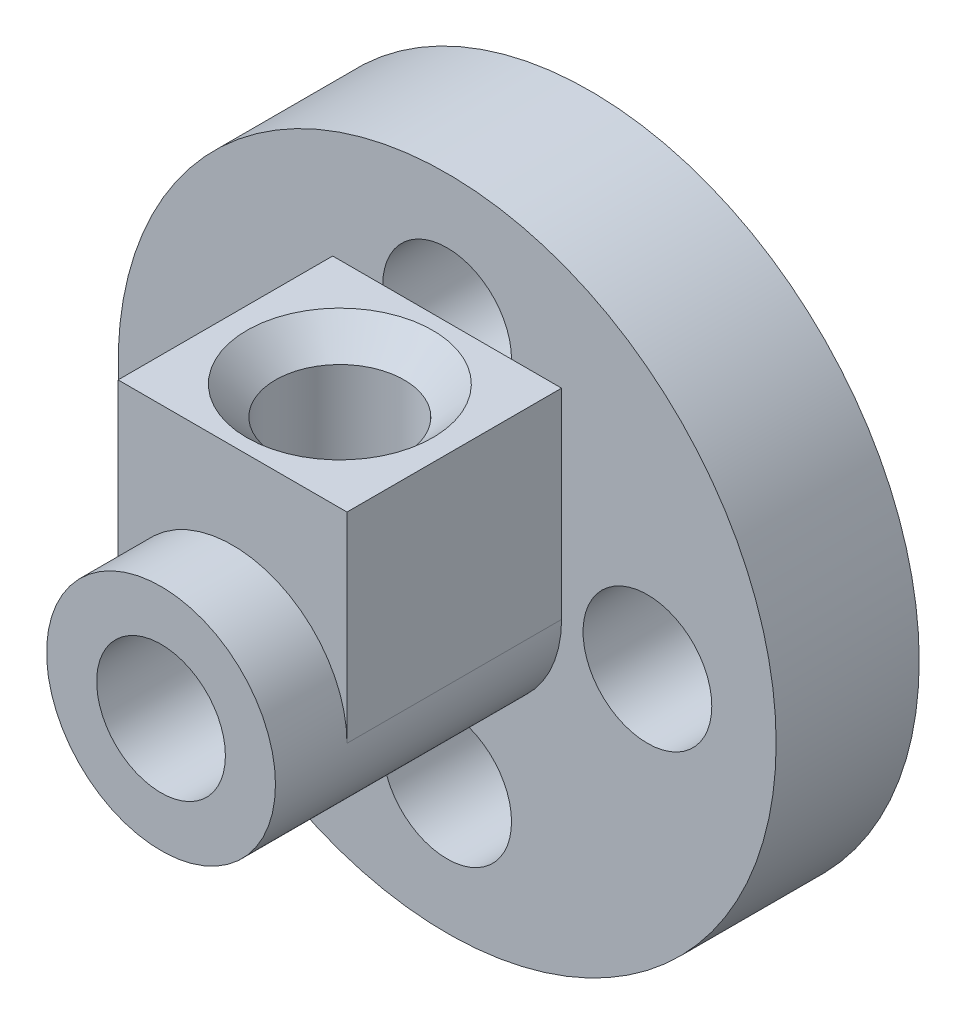
ISO-10303-21;
HEADER;
FILE_DESCRIPTION(('STEP AP214'),'2;1');
FILE_NAME('part.step','',(''),(''),'','','');
FILE_SCHEMA(('AUTOMOTIVE_DESIGN { 1 0 10303 214 1 1 1 1 }'));
ENDSEC;
DATA;
#1=APPLICATION_CONTEXT('core data for automotive mechanical design processes');
#2=APPLICATION_PROTOCOL_DEFINITION('international standard','automotive_design',2000,#1);
#3=PRODUCT_CONTEXT('',#1,'mechanical');
#4=PRODUCT('Part','Part','',(#3));
#5=PRODUCT_RELATED_PRODUCT_CATEGORY('part','',(#4));
#6=PRODUCT_DEFINITION_FORMATION('','',#4);
#7=PRODUCT_DEFINITION_CONTEXT('part definition',#1,'design');
#8=PRODUCT_DEFINITION('design','',#6,#7);
#9=PRODUCT_DEFINITION_SHAPE('','',#8);
#10=(LENGTH_UNIT() NAMED_UNIT(*) SI_UNIT(.MILLI.,.METRE.));
#11=(NAMED_UNIT(*) PLANE_ANGLE_UNIT() SI_UNIT($,.RADIAN.));
#12=(NAMED_UNIT(*) SI_UNIT($,.STERADIAN.) SOLID_ANGLE_UNIT());
#13=UNCERTAINTY_MEASURE_WITH_UNIT(LENGTH_MEASURE(1.E-05),#10,'distance_accuracy_value','');
#14=(GEOMETRIC_REPRESENTATION_CONTEXT(3) GLOBAL_UNCERTAINTY_ASSIGNED_CONTEXT((#13)) GLOBAL_UNIT_ASSIGNED_CONTEXT((#10,
#11,#12)) REPRESENTATION_CONTEXT('',''));
#15=CARTESIAN_POINT('',(0.,0.,0.));
#16=DIRECTION('',(0.,0.,1.));
#17=DIRECTION('',(1.,0.,0.));
#18=AXIS2_PLACEMENT_3D('',#15,#16,#17);
#19=CARTESIAN_POINT('',(0.,0.,15.));
#20=DIRECTION('',(0.,0.,-1.));
#21=DIRECTION('',(-1.,0.,0.));
#22=AXIS2_PLACEMENT_3D('',#19,#20,#21);
#23=CYLINDRICAL_SURFACE('',#22,4.);
#24=CARTESIAN_POINT('',(0.,0.,15.));
#25=DIRECTION('',(0.,0.,1.));
#26=DIRECTION('',(1.,0.,0.));
#27=AXIS2_PLACEMENT_3D('',#24,#25,#26);
#28=CIRCLE('',#27,4.);
#29=CARTESIAN_POINT('',(4.,0.,15.));
#30=VERTEX_POINT('',#29);
#31=EDGE_CURVE('E137',#30,#30,#28,.T.);
#32=ORIENTED_EDGE('',*,*,#31,.F.);
#33=EDGE_LOOP('',(#32));
#34=FACE_BOUND('',#33,.T.);
#35=DIRECTION('',(0.,0.,-1.));
#36=VECTOR('',#35,1.);
#37=CARTESIAN_POINT('',(4.,0.,15.));
#38=LINE('',#37,#36);
#39=CARTESIAN_POINT('',(4.,0.,5.));
#40=VERTEX_POINT('',#39);
#41=CARTESIAN_POINT('',(4.,0.,12.5));
#42=VERTEX_POINT('',#41);
#43=EDGE_CURVE('E97',#40,#42,#38,.F.);
#44=ORIENTED_EDGE('',*,*,#43,.T.);
#45=CARTESIAN_POINT('',(0.,0.,12.5));
#46=DIRECTION('',(0.,0.,1.));
#47=DIRECTION('',(1.,0.,0.));
#48=AXIS2_PLACEMENT_3D('',#45,#46,#47);
#49=CIRCLE('',#48,4.);
#50=CARTESIAN_POINT('',(-4.,0.,12.5));
#51=VERTEX_POINT('',#50);
#52=EDGE_CURVE('E119',#51,#42,#49,.F.);
#53=ORIENTED_EDGE('',*,*,#52,.F.);
#54=DIRECTION('',(0.,0.,-1.));
#55=VECTOR('',#54,1.);
#56=CARTESIAN_POINT('',(-4.,0.,15.));
#57=LINE('',#56,#55);
#58=CARTESIAN_POINT('',(-4.,0.,5.));
#59=VERTEX_POINT('',#58);
#60=EDGE_CURVE('E100',#59,#51,#57,.F.);
#61=ORIENTED_EDGE('',*,*,#60,.F.);
#62=CARTESIAN_POINT('',(0.,0.,5.));
#63=DIRECTION('',(0.,0.,1.));
#64=DIRECTION('',(1.,0.,0.));
#65=AXIS2_PLACEMENT_3D('',#62,#63,#64);
#66=CIRCLE('',#65,4.);
#67=EDGE_CURVE('E134',#59,#40,#66,.T.);
#68=ORIENTED_EDGE('',*,*,#67,.T.);
#69=EDGE_LOOP('',(#44,#53,#61,#68));
#70=FACE_BOUND('',#69,.T.);
#71=ADVANCED_FACE('F39',(#34,#70),#23,.T.);
#72=CARTESIAN_POINT('',(0.,0.,5.));
#73=DIRECTION('',(0.,0.,-1.));
#74=DIRECTION('',(-1.,0.,0.));
#75=AXIS2_PLACEMENT_3D('',#72,#73,#74);
#76=CYLINDRICAL_SURFACE('',#75,11.5);
#77=CARTESIAN_POINT('',(0.,0.,5.));
#78=DIRECTION('',(0.,0.,1.));
#79=DIRECTION('',(1.,0.,0.));
#80=AXIS2_PLACEMENT_3D('',#77,#78,#79);
#81=CIRCLE('',#80,11.5);
#82=CARTESIAN_POINT('',(11.5,0.,5.));
#83=VERTEX_POINT('',#82);
#84=EDGE_CURVE('E155',#83,#83,#81,.T.);
#85=ORIENTED_EDGE('',*,*,#84,.F.);
#86=EDGE_LOOP('',(#85));
#87=FACE_BOUND('',#86,.T.);
#88=CARTESIAN_POINT('',(0.,0.,0.));
#89=DIRECTION('',(0.,0.,1.));
#90=DIRECTION('',(1.,0.,0.));
#91=AXIS2_PLACEMENT_3D('',#88,#89,#90);
#92=CIRCLE('',#91,11.5);
#93=CARTESIAN_POINT('',(11.5,0.,0.));
#94=VERTEX_POINT('',#93);
#95=EDGE_CURVE('E154',#94,#94,#92,.T.);
#96=ORIENTED_EDGE('',*,*,#95,.T.);
#97=EDGE_LOOP('',(#96));
#98=FACE_BOUND('',#97,.T.);
#99=ADVANCED_FACE('F208',(#87,#98),#76,.T.);
#100=CARTESIAN_POINT('',(0.,0.,5.));
#101=DIRECTION('',(0.,0.,1.));
#102=DIRECTION('',(1.,0.,0.));
#103=AXIS2_PLACEMENT_3D('',#100,#101,#102);
#104=PLANE('',#103);
#105=DIRECTION('',(0.,1.,0.));
#106=VECTOR('',#105,1.);
#107=CARTESIAN_POINT('',(4.,-11.502,5.));
#108=LINE('',#107,#106);
#109=CARTESIAN_POINT('',(4.,7.,5.));
#110=VERTEX_POINT('',#109);
#111=EDGE_CURVE('E124',#40,#110,#108,.T.);
#112=ORIENTED_EDGE('',*,*,#111,.F.);
#113=ORIENTED_EDGE('',*,*,#67,.F.);
#114=DIRECTION('',(0.,1.,0.));
#115=VECTOR('',#114,1.);
#116=CARTESIAN_POINT('',(-4.,-11.502,5.));
#117=LINE('',#116,#115);
#118=CARTESIAN_POINT('',(-4.,7.,5.));
#119=VERTEX_POINT('',#118);
#120=EDGE_CURVE('E62',#59,#119,#117,.T.);
#121=ORIENTED_EDGE('',*,*,#120,.T.);
#122=DIRECTION('',(-1.,0.,0.));
#123=VECTOR('',#122,1.);
#124=CARTESIAN_POINT('',(-4.,7.,5.));
#125=LINE('',#124,#123);
#126=CARTESIAN_POINT('',(-2.25,7.,5.));
#127=VERTEX_POINT('',#126);
#128=EDGE_CURVE('E111',#127,#119,#125,.T.);
#129=ORIENTED_EDGE('',*,*,#128,.F.);
#130=CARTESIAN_POINT('',(0.,7.,5.));
#131=DIRECTION('',(0.,0.,1.));
#132=DIRECTION('',(1.,0.,0.));
#133=AXIS2_PLACEMENT_3D('',#130,#131,#132);
#134=CIRCLE('',#133,2.25);
#135=CARTESIAN_POINT('',(2.25,7.,5.));
#136=VERTEX_POINT('',#135);
#137=EDGE_CURVE('E146',#136,#127,#134,.T.);
#138=ORIENTED_EDGE('',*,*,#137,.F.);
#139=EDGE_CURVE('E107',#110,#136,#125,.T.);
#140=ORIENTED_EDGE('',*,*,#139,.F.);
#141=EDGE_LOOP('',(#112,#113,#121,#129,#138,#140));
#142=FACE_BOUND('',#141,.T.);
#143=CARTESIAN_POINT('',(-7.,0.,5.));
#144=DIRECTION('',(0.,0.,1.));
#145=DIRECTION('',(0.,1.,0.));
#146=AXIS2_PLACEMENT_3D('',#143,#144,#145);
#147=CIRCLE('',#146,2.25);
#148=CARTESIAN_POINT('',(-7.00000000000001,2.24999999999998,5.));
#149=VERTEX_POINT('',#148);
#150=EDGE_CURVE('E143',#149,#149,#147,.T.);
#151=ORIENTED_EDGE('',*,*,#150,.F.);
#152=EDGE_LOOP('',(#151));
#153=FACE_BOUND('',#152,.T.);
#154=CARTESIAN_POINT('',(0.,-7.,5.));
#155=DIRECTION('',(0.,0.,1.));
#156=DIRECTION('',(-1.,0.,0.));
#157=AXIS2_PLACEMENT_3D('',#154,#155,#156);
#158=CIRCLE('',#157,2.25);
#159=CARTESIAN_POINT('',(-2.25,-7.,5.));
#160=VERTEX_POINT('',#159);
#161=EDGE_CURVE('E147',#160,#160,#158,.T.);
#162=ORIENTED_EDGE('',*,*,#161,.F.);
#163=EDGE_LOOP('',(#162));
#164=FACE_BOUND('',#163,.T.);
#165=CARTESIAN_POINT('',(7.,0.,5.));
#166=DIRECTION('',(0.,0.,1.));
#167=DIRECTION('',(0.,-1.,0.));
#168=AXIS2_PLACEMENT_3D('',#165,#166,#167);
#169=CIRCLE('',#168,2.25);
#170=CARTESIAN_POINT('',(7.00000000000002,-2.24999999999993,5.));
#171=VERTEX_POINT('',#170);
#172=EDGE_CURVE('E140',#171,#171,#169,.T.);
#173=ORIENTED_EDGE('',*,*,#172,.F.);
#174=EDGE_LOOP('',(#173));
#175=FACE_BOUND('',#174,.T.);
#176=ORIENTED_EDGE('',*,*,#84,.T.);
#177=EDGE_LOOP('',(#176));
#178=FACE_BOUND('',#177,.T.);
#179=ADVANCED_FACE('F199',(#142,#153,#164,#175,#178),#104,.T.);
#180=CARTESIAN_POINT('',(0.,0.,0.));
#181=DIRECTION('',(0.,0.,1.));
#182=DIRECTION('',(1.,0.,0.));
#183=AXIS2_PLACEMENT_3D('',#180,#181,#182);
#184=PLANE('',#183);
#185=CARTESIAN_POINT('',(0.,-7.,0.));
#186=DIRECTION('',(0.,0.,1.));
#187=DIRECTION('',(1.,0.,0.));
#188=AXIS2_PLACEMENT_3D('',#185,#186,#187);
#189=CIRCLE('',#188,3.25);
#190=CARTESIAN_POINT('',(3.25,-7.,0.));
#191=VERTEX_POINT('',#190);
#192=EDGE_CURVE('E175',#191,#191,#189,.T.);
#193=ORIENTED_EDGE('',*,*,#192,.T.);
#194=EDGE_LOOP('',(#193));
#195=FACE_BOUND('',#194,.T.);
#196=CARTESIAN_POINT('',(-7.,0.,0.));
#197=DIRECTION('',(0.,0.,1.));
#198=DIRECTION('',(1.,0.,0.));
#199=AXIS2_PLACEMENT_3D('',#196,#197,#198);
#200=CIRCLE('',#199,3.25);
#201=CARTESIAN_POINT('',(-3.75,0.,0.));
#202=VERTEX_POINT('',#201);
#203=EDGE_CURVE('E172',#202,#202,#200,.T.);
#204=ORIENTED_EDGE('',*,*,#203,.T.);
#205=EDGE_LOOP('',(#204));
#206=FACE_BOUND('',#205,.T.);
#207=CARTESIAN_POINT('',(7.,0.,0.));
#208=DIRECTION('',(0.,0.,1.));
#209=DIRECTION('',(1.,0.,0.));
#210=AXIS2_PLACEMENT_3D('',#207,#208,#209);
#211=CIRCLE('',#210,3.25);
#212=CARTESIAN_POINT('',(10.25,0.,0.));
#213=VERTEX_POINT('',#212);
#214=EDGE_CURVE('E169',#213,#213,#211,.T.);
#215=ORIENTED_EDGE('',*,*,#214,.T.);
#216=EDGE_LOOP('',(#215));
#217=FACE_BOUND('',#216,.T.);
#218=CARTESIAN_POINT('',(0.,7.,0.));
#219=DIRECTION('',(0.,0.,1.));
#220=DIRECTION('',(1.,0.,0.));
#221=AXIS2_PLACEMENT_3D('',#218,#219,#220);
#222=CIRCLE('',#221,3.25);
#223=CARTESIAN_POINT('',(3.25,7.,0.));
#224=VERTEX_POINT('',#223);
#225=EDGE_CURVE('E166',#224,#224,#222,.T.);
#226=ORIENTED_EDGE('',*,*,#225,.T.);
#227=EDGE_LOOP('',(#226));
#228=FACE_BOUND('',#227,.T.);
#229=CARTESIAN_POINT('',(0.,0.,0.));
#230=DIRECTION('',(0.,0.,1.));
#231=DIRECTION('',(1.,0.,0.));
#232=AXIS2_PLACEMENT_3D('',#229,#230,#231);
#233=CIRCLE('',#232,2.25);
#234=CARTESIAN_POINT('',(2.25,0.,0.));
#235=VERTEX_POINT('',#234);
#236=EDGE_CURVE('E131',#235,#235,#233,.T.);
#237=ORIENTED_EDGE('',*,*,#236,.T.);
#238=EDGE_LOOP('',(#237));
#239=FACE_BOUND('',#238,.T.);
#240=ORIENTED_EDGE('',*,*,#95,.F.);
#241=EDGE_LOOP('',(#240));
#242=FACE_BOUND('',#241,.T.);
#243=ADVANCED_FACE('F195',(#195,#206,#217,#228,#239,#242),#184,.F.);
#244=CARTESIAN_POINT('',(0.,7.,0.));
#245=DIRECTION('',(0.,0.,1.));
#246=DIRECTION('',(1.,0.,0.));
#247=AXIS2_PLACEMENT_3D('',#244,#245,#246);
#248=CYLINDRICAL_SURFACE('',#247,2.25);
#249=CARTESIAN_POINT('',(0.,7.,1.));
#250=DIRECTION('',(0.,0.,1.));
#251=DIRECTION('',(1.,0.,0.));
#252=AXIS2_PLACEMENT_3D('',#249,#250,#251);
#253=CIRCLE('',#252,2.25);
#254=CARTESIAN_POINT('',(2.25,7.,1.));
#255=VERTEX_POINT('',#254);
#256=EDGE_CURVE('E11',#255,#255,#253,.F.);
#257=ORIENTED_EDGE('',*,*,#256,.T.);
#258=EDGE_LOOP('',(#257));
#259=FACE_BOUND('',#258,.T.);
#260=ORIENTED_EDGE('',*,*,#137,.T.);
#261=CARTESIAN_POINT('',(0.,7.,5.));
#262=DIRECTION('',(0.,0.,-1.));
#263=DIRECTION('',(-1.,0.,0.));
#264=AXIS2_PLACEMENT_3D('',#261,#262,#263);
#265=CIRCLE('',#264,2.25);
#266=EDGE_CURVE('E115',#127,#136,#265,.F.);
#267=ORIENTED_EDGE('',*,*,#266,.T.);
#268=EDGE_LOOP('',(#260,#267));
#269=FACE_BOUND('',#268,.T.);
#270=ADVANCED_FACE('F198',(#259,#269),#248,.F.);
#271=CARTESIAN_POINT('',(7.,0.,0.));
#272=DIRECTION('',(0.,0.,1.));
#273=DIRECTION('',(1.,0.,0.));
#274=AXIS2_PLACEMENT_3D('',#271,#272,#273);
#275=CYLINDRICAL_SURFACE('',#274,2.25);
#276=CARTESIAN_POINT('',(7.,0.,1.));
#277=DIRECTION('',(0.,0.,1.));
#278=DIRECTION('',(1.,0.,0.));
#279=AXIS2_PLACEMENT_3D('',#276,#277,#278);
#280=CIRCLE('',#279,2.25);
#281=CARTESIAN_POINT('',(9.25,0.,1.));
#282=VERTEX_POINT('',#281);
#283=EDGE_CURVE('E48',#282,#282,#280,.F.);
#284=ORIENTED_EDGE('',*,*,#283,.T.);
#285=EDGE_LOOP('',(#284));
#286=FACE_BOUND('',#285,.T.);
#287=ORIENTED_EDGE('',*,*,#172,.T.);
#288=EDGE_LOOP('',(#287));
#289=FACE_BOUND('',#288,.T.);
#290=ADVANCED_FACE('F186',(#286,#289),#275,.F.);
#291=CARTESIAN_POINT('',(0.,-7.,0.));
#292=DIRECTION('',(0.,0.,1.));
#293=DIRECTION('',(1.,0.,0.));
#294=AXIS2_PLACEMENT_3D('',#291,#292,#293);
#295=CYLINDRICAL_SURFACE('',#294,2.25);
#296=CARTESIAN_POINT('',(0.,-7.,1.));
#297=DIRECTION('',(0.,0.,1.));
#298=DIRECTION('',(1.,0.,0.));
#299=AXIS2_PLACEMENT_3D('',#296,#297,#298);
#300=CIRCLE('',#299,2.25);
#301=CARTESIAN_POINT('',(2.25,-7.,1.));
#302=VERTEX_POINT('',#301);
#303=EDGE_CURVE('E178',#302,#302,#300,.F.);
#304=ORIENTED_EDGE('',*,*,#303,.T.);
#305=EDGE_LOOP('',(#304));
#306=FACE_BOUND('',#305,.T.);
#307=ORIENTED_EDGE('',*,*,#161,.T.);
#308=EDGE_LOOP('',(#307));
#309=FACE_BOUND('',#308,.T.);
#310=ADVANCED_FACE('F257',(#306,#309),#295,.F.);
#311=CARTESIAN_POINT('',(-7.,0.,0.));
#312=DIRECTION('',(0.,0.,1.));
#313=DIRECTION('',(1.,0.,0.));
#314=AXIS2_PLACEMENT_3D('',#311,#312,#313);
#315=CYLINDRICAL_SURFACE('',#314,2.25);
#316=CARTESIAN_POINT('',(-7.,0.,1.));
#317=DIRECTION('',(0.,0.,1.));
#318=DIRECTION('',(1.,0.,0.));
#319=AXIS2_PLACEMENT_3D('',#316,#317,#318);
#320=CIRCLE('',#319,2.25);
#321=CARTESIAN_POINT('',(-4.75,0.,1.));
#322=VERTEX_POINT('',#321);
#323=EDGE_CURVE('E181',#322,#322,#320,.F.);
#324=ORIENTED_EDGE('',*,*,#323,.T.);
#325=EDGE_LOOP('',(#324));
#326=FACE_BOUND('',#325,.T.);
#327=ORIENTED_EDGE('',*,*,#150,.T.);
#328=EDGE_LOOP('',(#327));
#329=FACE_BOUND('',#328,.T.);
#330=ADVANCED_FACE('F253',(#326,#329),#315,.F.);
#331=CARTESIAN_POINT('',(0.,0.,15.));
#332=DIRECTION('',(0.,0.,1.));
#333=DIRECTION('',(1.,0.,0.));
#334=AXIS2_PLACEMENT_3D('',#331,#332,#333);
#335=PLANE('',#334);
#336=CARTESIAN_POINT('',(0.,0.,15.));
#337=DIRECTION('',(0.,0.,1.));
#338=DIRECTION('',(1.,0.,0.));
#339=AXIS2_PLACEMENT_3D('',#336,#337,#338);
#340=CIRCLE('',#339,2.25);
#341=CARTESIAN_POINT('',(2.25,0.,15.));
#342=VERTEX_POINT('',#341);
#343=EDGE_CURVE('E130',#342,#342,#340,.T.);
#344=ORIENTED_EDGE('',*,*,#343,.F.);
#345=EDGE_LOOP('',(#344));
#346=FACE_BOUND('',#345,.T.);
#347=ORIENTED_EDGE('',*,*,#31,.T.);
#348=EDGE_LOOP('',(#347));
#349=FACE_BOUND('',#348,.T.);
#350=ADVANCED_FACE('F256',(#346,#349),#335,.T.);
#351=CARTESIAN_POINT('',(0.,0.,0.));
#352=DIRECTION('',(0.,0.,1.));
#353=DIRECTION('',(1.,0.,0.));
#354=AXIS2_PLACEMENT_3D('',#351,#352,#353);
#355=CYLINDRICAL_SURFACE('',#354,2.25);
#356=CARTESIAN_POINT('',(0.,0.,8.75));
#357=DIRECTION('',(0.,-0.707106781186547,0.707106781186547));
#358=DIRECTION('',(0.,0.707106781186547,0.707106781186547));
#359=AXIS2_PLACEMENT_3D('',#356,#357,#358);
#360=ELLIPSE('',#359,3.18198051533946,2.25);
#361=CARTESIAN_POINT('',(-2.25,0.,8.75));
#362=VERTEX_POINT('',#361);
#363=CARTESIAN_POINT('',(2.25,0.,8.75));
#364=VERTEX_POINT('',#363);
#365=EDGE_CURVE('E91',#362,#364,#360,.F.);
#366=ORIENTED_EDGE('',*,*,#365,.T.);
#367=CARTESIAN_POINT('',(0.,0.,8.75));
#368=DIRECTION('',(0.,0.707106781186547,0.707106781186547));
#369=DIRECTION('',(0.,-0.707106781186547,0.707106781186547));
#370=AXIS2_PLACEMENT_3D('',#367,#368,#369);
#371=ELLIPSE('',#370,3.18198051533946,2.25);
#372=EDGE_CURVE('E54',#364,#362,#371,.T.);
#373=ORIENTED_EDGE('',*,*,#372,.T.);
#374=EDGE_LOOP('',(#366,#373));
#375=FACE_BOUND('',#374,.T.);
#376=ORIENTED_EDGE('',*,*,#236,.F.);
#377=EDGE_LOOP('',(#376));
#378=FACE_BOUND('',#377,.T.);
#379=ORIENTED_EDGE('',*,*,#343,.T.);
#380=EDGE_LOOP('',(#379));
#381=FACE_BOUND('',#380,.T.);
#382=ADVANCED_FACE('F95',(#375,#378,#381),#355,.F.);
#383=CARTESIAN_POINT('',(-4.,-11.502,5.));
#384=DIRECTION('',(0.,0.,-1.));
#385=DIRECTION('',(-1.,0.,0.));
#386=AXIS2_PLACEMENT_3D('',#383,#384,#385);
#387=PLANE('',#386);
#388=ORIENTED_EDGE('',*,*,#266,.F.);
#389=EDGE_CURVE('E110',#136,#127,#125,.T.);
#390=ORIENTED_EDGE('',*,*,#389,.F.);
#391=EDGE_LOOP('',(#388,#390));
#392=FACE_BOUND('',#391,.T.);
#393=ADVANCED_FACE('F282',(#392),#387,.T.);
#394=CARTESIAN_POINT('',(4.,-11.502,5.));
#395=DIRECTION('',(1.,0.,0.));
#396=DIRECTION('',(0.,0.,-1.));
#397=AXIS2_PLACEMENT_3D('',#394,#395,#396);
#398=PLANE('',#397);
#399=ORIENTED_EDGE('',*,*,#43,.F.);
#400=ORIENTED_EDGE('',*,*,#111,.T.);
#401=DIRECTION('',(0.,0.,-1.));
#402=VECTOR('',#401,1.);
#403=CARTESIAN_POINT('',(4.,7.,5.));
#404=LINE('',#403,#402);
#405=CARTESIAN_POINT('',(4.,7.,12.5));
#406=VERTEX_POINT('',#405);
#407=EDGE_CURVE('E103',#406,#110,#404,.T.);
#408=ORIENTED_EDGE('',*,*,#407,.F.);
#409=DIRECTION('',(0.,1.,0.));
#410=VECTOR('',#409,1.);
#411=CARTESIAN_POINT('',(4.,-11.502,12.5));
#412=LINE('',#411,#410);
#413=EDGE_CURVE('E122',#42,#406,#412,.T.);
#414=ORIENTED_EDGE('',*,*,#413,.F.);
#415=EDGE_LOOP('',(#399,#400,#408,#414));
#416=FACE_BOUND('',#415,.T.);
#417=ADVANCED_FACE('F287',(#416),#398,.T.);
#418=CARTESIAN_POINT('',(-4.,-11.502,12.5));
#419=DIRECTION('',(0.,0.,1.));
#420=DIRECTION('',(1.,0.,0.));
#421=AXIS2_PLACEMENT_3D('',#418,#419,#420);
#422=PLANE('',#421);
#423=DIRECTION('',(0.,1.,0.));
#424=VECTOR('',#423,1.);
#425=CARTESIAN_POINT('',(-4.,-11.502,12.5));
#426=LINE('',#425,#424);
#427=CARTESIAN_POINT('',(-4.,7.,12.5));
#428=VERTEX_POINT('',#427);
#429=EDGE_CURVE('E120',#51,#428,#426,.T.);
#430=ORIENTED_EDGE('',*,*,#429,.F.);
#431=ORIENTED_EDGE('',*,*,#52,.T.);
#432=ORIENTED_EDGE('',*,*,#413,.T.);
#433=DIRECTION('',(1.,0.,0.));
#434=VECTOR('',#433,1.);
#435=CARTESIAN_POINT('',(-4.,7.,12.5));
#436=LINE('',#435,#434);
#437=EDGE_CURVE('E106',#428,#406,#436,.T.);
#438=ORIENTED_EDGE('',*,*,#437,.F.);
#439=EDGE_LOOP('',(#430,#431,#432,#438));
#440=FACE_BOUND('',#439,.T.);
#441=ADVANCED_FACE('F283',(#440),#422,.T.);
#442=CARTESIAN_POINT('',(-4.,-11.502,5.));
#443=DIRECTION('',(-1.,0.,0.));
#444=DIRECTION('',(0.,0.,1.));
#445=AXIS2_PLACEMENT_3D('',#442,#443,#444);
#446=PLANE('',#445);
#447=ORIENTED_EDGE('',*,*,#120,.F.);
#448=ORIENTED_EDGE('',*,*,#60,.T.);
#449=ORIENTED_EDGE('',*,*,#429,.T.);
#450=DIRECTION('',(0.,0.,1.));
#451=VECTOR('',#450,1.);
#452=CARTESIAN_POINT('',(-4.,7.,5.));
#453=LINE('',#452,#451);
#454=EDGE_CURVE('E112',#119,#428,#453,.T.);
#455=ORIENTED_EDGE('',*,*,#454,.F.);
#456=EDGE_LOOP('',(#447,#448,#449,#455));
#457=FACE_BOUND('',#456,.T.);
#458=ADVANCED_FACE('F286',(#457),#446,.T.);
#459=CARTESIAN_POINT('',(0.,7.,0.));
#460=DIRECTION('',(0.,1.,0.));
#461=DIRECTION('',(0.,0.,1.));
#462=AXIS2_PLACEMENT_3D('',#459,#460,#461);
#463=PLANE('',#462);
#464=CARTESIAN_POINT('',(0.,7.,8.75));
#465=DIRECTION('',(0.,1.,0.));
#466=DIRECTION('',(0.,0.,1.));
#467=AXIS2_PLACEMENT_3D('',#464,#465,#466);
#468=CIRCLE('',#467,3.25);
#469=CARTESIAN_POINT('',(0.,7.,12.));
#470=VERTEX_POINT('',#469);
#471=EDGE_CURVE('E163',#470,#470,#468,.F.);
#472=ORIENTED_EDGE('',*,*,#471,.T.);
#473=EDGE_LOOP('',(#472));
#474=FACE_BOUND('',#473,.T.);
#475=ORIENTED_EDGE('',*,*,#454,.T.);
#476=ORIENTED_EDGE('',*,*,#437,.T.);
#477=ORIENTED_EDGE('',*,*,#407,.T.);
#478=ORIENTED_EDGE('',*,*,#139,.T.);
#479=ORIENTED_EDGE('',*,*,#389,.T.);
#480=ORIENTED_EDGE('',*,*,#128,.T.);
#481=EDGE_LOOP('',(#475,#476,#477,#478,#479,#480));
#482=FACE_BOUND('',#481,.T.);
#483=ADVANCED_FACE('F294',(#474,#482),#463,.T.);
#484=CARTESIAN_POINT('',(0.,0.,8.75));
#485=DIRECTION('',(0.,1.,0.));
#486=DIRECTION('',(0.,0.,1.));
#487=AXIS2_PLACEMENT_3D('',#484,#485,#486);
#488=CYLINDRICAL_SURFACE('',#487,2.25);
#489=CARTESIAN_POINT('',(0.,6.,8.75));
#490=DIRECTION('',(0.,1.,0.));
#491=DIRECTION('',(0.,0.,1.));
#492=AXIS2_PLACEMENT_3D('',#489,#490,#491);
#493=CIRCLE('',#492,2.25);
#494=CARTESIAN_POINT('',(0.,6.,11.));
#495=VERTEX_POINT('',#494);
#496=EDGE_CURVE('E158',#495,#495,#493,.T.);
#497=ORIENTED_EDGE('',*,*,#496,.T.);
#498=EDGE_LOOP('',(#497));
#499=FACE_BOUND('',#498,.T.);
#500=ORIENTED_EDGE('',*,*,#365,.F.);
#501=ORIENTED_EDGE('',*,*,#372,.F.);
#502=EDGE_LOOP('',(#500,#501));
#503=FACE_BOUND('',#502,.T.);
#504=ADVANCED_FACE('F92',(#499,#503),#488,.F.);
#505=CARTESIAN_POINT('',(0.,6.,8.75));
#506=DIRECTION('',(0.,1.,0.));
#507=DIRECTION('',(0.,0.,1.));
#508=AXIS2_PLACEMENT_3D('',#505,#506,#507);
#509=CONICAL_SURFACE('',#508,2.25,0.785398163397449);
#510=ORIENTED_EDGE('',*,*,#471,.F.);
#511=EDGE_LOOP('',(#510));
#512=FACE_BOUND('',#511,.T.);
#513=ORIENTED_EDGE('',*,*,#496,.F.);
#514=EDGE_LOOP('',(#513));
#515=FACE_BOUND('',#514,.T.);
#516=ADVANCED_FACE('F223',(#512,#515),#509,.F.);
#517=CARTESIAN_POINT('',(0.,-7.,0.));
#518=DIRECTION('',(0.,0.,-1.));
#519=DIRECTION('',(-1.,0.,0.));
#520=AXIS2_PLACEMENT_3D('',#517,#518,#519);
#521=CONICAL_SURFACE('',#520,3.25,0.785398163397447);
#522=ORIENTED_EDGE('',*,*,#303,.F.);
#523=EDGE_LOOP('',(#522));
#524=FACE_BOUND('',#523,.T.);
#525=ORIENTED_EDGE('',*,*,#192,.F.);
#526=EDGE_LOOP('',(#525));
#527=FACE_BOUND('',#526,.T.);
#528=ADVANCED_FACE('F229',(#524,#527),#521,.F.);
#529=CARTESIAN_POINT('',(-7.,0.,0.));
#530=DIRECTION('',(0.,0.,-1.));
#531=DIRECTION('',(-1.,0.,0.));
#532=AXIS2_PLACEMENT_3D('',#529,#530,#531);
#533=CONICAL_SURFACE('',#532,3.25,0.785398163397447);
#534=ORIENTED_EDGE('',*,*,#323,.F.);
#535=EDGE_LOOP('',(#534));
#536=FACE_BOUND('',#535,.T.);
#537=ORIENTED_EDGE('',*,*,#203,.F.);
#538=EDGE_LOOP('',(#537));
#539=FACE_BOUND('',#538,.T.);
#540=ADVANCED_FACE('F192',(#536,#539),#533,.F.);
#541=CARTESIAN_POINT('',(7.,0.,0.));
#542=DIRECTION('',(0.,0.,-1.));
#543=DIRECTION('',(-1.,0.,0.));
#544=AXIS2_PLACEMENT_3D('',#541,#542,#543);
#545=CONICAL_SURFACE('',#544,3.25,0.785398163397447);
#546=ORIENTED_EDGE('',*,*,#283,.F.);
#547=EDGE_LOOP('',(#546));
#548=FACE_BOUND('',#547,.T.);
#549=ORIENTED_EDGE('',*,*,#214,.F.);
#550=EDGE_LOOP('',(#549));
#551=FACE_BOUND('',#550,.T.);
#552=ADVANCED_FACE('F189',(#548,#551),#545,.F.);
#553=CARTESIAN_POINT('',(0.,7.,0.));
#554=DIRECTION('',(0.,0.,-1.));
#555=DIRECTION('',(-1.,0.,0.));
#556=AXIS2_PLACEMENT_3D('',#553,#554,#555);
#557=CONICAL_SURFACE('',#556,3.25,0.785398163397447);
#558=ORIENTED_EDGE('',*,*,#256,.F.);
#559=EDGE_LOOP('',(#558));
#560=FACE_BOUND('',#559,.T.);
#561=ORIENTED_EDGE('',*,*,#225,.F.);
#562=EDGE_LOOP('',(#561));
#563=FACE_BOUND('',#562,.T.);
#564=ADVANCED_FACE('F42',(#560,#563),#557,.F.);
#565=CLOSED_SHELL('',(#71,#99,#179,#243,#270,#290,#310,#330,#350,#382,#393,#417,#441,#458,#483,
#504,#516,#528,#540,#552,#564));
#566=MANIFOLD_SOLID_BREP('B2',#565);
#567=ADVANCED_BREP_SHAPE_REPRESENTATION('',(#18,#566),#14);
#568=SHAPE_DEFINITION_REPRESENTATION(#9,#567);
ENDSEC;
END-ISO-10303-21;
